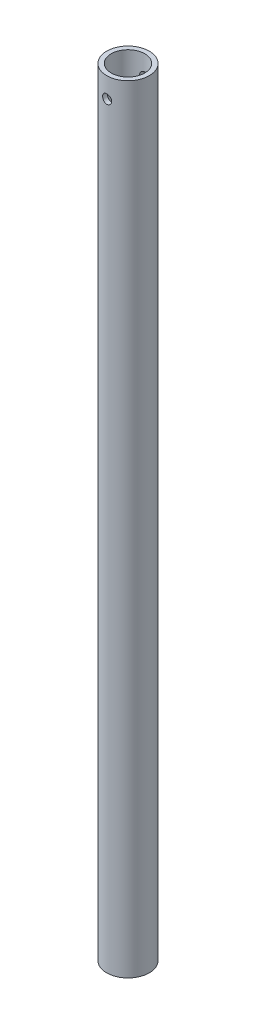
ISO-10303-21;
HEADER;
FILE_DESCRIPTION(('STEP AP214'),'2;1');
FILE_NAME('part.step','',(''),(''),'','','');
FILE_SCHEMA(('AUTOMOTIVE_DESIGN { 1 0 10303 214 1 1 1 1 }'));
ENDSEC;
DATA;
#1=APPLICATION_CONTEXT('core data for automotive mechanical design processes');
#2=APPLICATION_PROTOCOL_DEFINITION('international standard','automotive_design',2000,#1);
#3=PRODUCT_CONTEXT('',#1,'mechanical');
#4=PRODUCT('Part','Part','',(#3));
#5=PRODUCT_RELATED_PRODUCT_CATEGORY('part','',(#4));
#6=PRODUCT_DEFINITION_FORMATION('','',#4);
#7=PRODUCT_DEFINITION_CONTEXT('part definition',#1,'design');
#8=PRODUCT_DEFINITION('design','',#6,#7);
#9=PRODUCT_DEFINITION_SHAPE('','',#8);
#10=(LENGTH_UNIT() NAMED_UNIT(*) SI_UNIT(.MILLI.,.METRE.));
#11=(NAMED_UNIT(*) PLANE_ANGLE_UNIT() SI_UNIT($,.RADIAN.));
#12=(NAMED_UNIT(*) SI_UNIT($,.STERADIAN.) SOLID_ANGLE_UNIT());
#13=UNCERTAINTY_MEASURE_WITH_UNIT(LENGTH_MEASURE(1.E-05),#10,'distance_accuracy_value','');
#14=(GEOMETRIC_REPRESENTATION_CONTEXT(3) GLOBAL_UNCERTAINTY_ASSIGNED_CONTEXT((#13)) GLOBAL_UNIT_ASSIGNED_CONTEXT((#10,
#11,#12)) REPRESENTATION_CONTEXT('',''));
#15=CARTESIAN_POINT('',(0.,0.,0.));
#16=DIRECTION('',(0.,0.,1.));
#17=DIRECTION('',(1.,0.,0.));
#18=AXIS2_PLACEMENT_3D('',#15,#16,#17);
#19=CARTESIAN_POINT('',(0.,0.,0.));
#20=DIRECTION('',(0.,1.,0.));
#21=DIRECTION('',(0.,0.,1.));
#22=AXIS2_PLACEMENT_3D('',#19,#20,#21);
#23=PLANE('',#22);
#24=CARTESIAN_POINT('',(0.,0.,0.));
#25=DIRECTION('',(0.,1.,0.));
#26=DIRECTION('',(0.,0.,1.));
#27=AXIS2_PLACEMENT_3D('',#24,#25,#26);
#28=CIRCLE('',#27,13.1445);
#29=CARTESIAN_POINT('',(0.,0.,13.1445));
#30=VERTEX_POINT('',#29);
#31=EDGE_CURVE('E86',#30,#30,#28,.T.);
#32=ORIENTED_EDGE('',*,*,#31,.T.);
#33=EDGE_LOOP('',(#32));
#34=FACE_BOUND('',#33,.T.);
#35=CARTESIAN_POINT('',(0.,0.,0.));
#36=DIRECTION('',(0.,1.,0.));
#37=DIRECTION('',(0.,0.,1.));
#38=AXIS2_PLACEMENT_3D('',#35,#36,#37);
#39=CIRCLE('',#38,16.7005);
#40=CARTESIAN_POINT('',(0.,0.,16.7005));
#41=VERTEX_POINT('',#40);
#42=EDGE_CURVE('E55',#41,#41,#39,.T.);
#43=ORIENTED_EDGE('',*,*,#42,.F.);
#44=EDGE_LOOP('',(#43));
#45=FACE_BOUND('',#44,.T.);
#46=ADVANCED_FACE('F36',(#34,#45),#23,.F.);
#47=CARTESIAN_POINT('',(0.,609.6,0.));
#48=DIRECTION('',(0.,1.,0.));
#49=DIRECTION('',(0.,0.,1.));
#50=AXIS2_PLACEMENT_3D('',#47,#48,#49);
#51=PLANE('',#50);
#52=CARTESIAN_POINT('',(0.,609.6,0.));
#53=DIRECTION('',(0.,1.,0.));
#54=DIRECTION('',(0.,0.,1.));
#55=AXIS2_PLACEMENT_3D('',#52,#53,#54);
#56=CIRCLE('',#55,13.1445);
#57=CARTESIAN_POINT('',(0.,609.6,13.1445));
#58=VERTEX_POINT('',#57);
#59=EDGE_CURVE('E87',#58,#58,#56,.T.);
#60=ORIENTED_EDGE('',*,*,#59,.F.);
#61=EDGE_LOOP('',(#60));
#62=FACE_BOUND('',#61,.T.);
#63=CARTESIAN_POINT('',(0.,609.6,0.));
#64=DIRECTION('',(0.,1.,0.));
#65=DIRECTION('',(0.,0.,1.));
#66=AXIS2_PLACEMENT_3D('',#63,#64,#65);
#67=CIRCLE('',#66,16.7005);
#68=CARTESIAN_POINT('',(0.,609.6,16.7005));
#69=VERTEX_POINT('',#68);
#70=EDGE_CURVE('E51',#69,#69,#67,.T.);
#71=ORIENTED_EDGE('',*,*,#70,.T.);
#72=EDGE_LOOP('',(#71));
#73=FACE_BOUND('',#72,.T.);
#74=ADVANCED_FACE('F96',(#62,#73),#51,.T.);
#75=CARTESIAN_POINT('',(0.,0.,0.));
#76=DIRECTION('',(0.,1.,0.));
#77=DIRECTION('',(0.,0.,1.));
#78=AXIS2_PLACEMENT_3D('',#75,#76,#77);
#79=CYLINDRICAL_SURFACE('',#78,16.7005);
#80=CARTESIAN_POINT('',(0.,590.15376,16.7005));
#81=CARTESIAN_POINT('',(0.198180128467397,590.153766916919,16.7004963337488));
#82=CARTESIAN_POINT('',(0.39644485112555,590.170312231521,16.6969364344142));
#83=CARTESIAN_POINT('',(0.787350043252914,590.235991986569,16.6830790056128));
#84=CARTESIAN_POINT('',(0.979986263864115,590.285150414705,16.6727765168931));
#85=CARTESIAN_POINT('',(1.35392789600151,590.41445216763,16.6465819057805));
#86=CARTESIAN_POINT('',(1.53524466181015,590.494563844422,16.6306954941354));
#87=CARTESIAN_POINT('',(1.88185554342918,590.683399266575,16.5950509562576));
#88=CARTESIAN_POINT('',(2.04715021727184,590.792122014952,16.5752929649404));
#89=CARTESIAN_POINT('',(2.35957433760585,591.036863258493,16.533732772831));
#90=CARTESIAN_POINT('',(2.506422105691,591.173237216087,16.5119061563597));
#91=CARTESIAN_POINT('',(2.77534243826499,591.468646328024,16.4688422330848));
#92=CARTESIAN_POINT('',(2.89741287037584,591.627683430791,16.4476049771382));
#93=CARTESIAN_POINT('',(3.11454439668957,591.965971846837,16.4078842607787));
#94=CARTESIAN_POINT('',(3.20930782685882,592.145418222158,16.3894321223851));
#95=CARTESIAN_POINT('',(3.36722665713713,592.518147724438,16.3577203528158));
#96=CARTESIAN_POINT('',(3.43038565777865,592.711429272356,16.344460130189));
#97=CARTESIAN_POINT('',(3.52237626915555,593.103293597183,16.3248818041431));
#98=CARTESIAN_POINT('',(3.55170540502194,593.301754451834,16.3184631931365));
#99=CARTESIAN_POINT('',(3.57675029818604,593.700875634117,16.3129928008047));
#100=CARTESIAN_POINT('',(3.57246999855778,593.901535700977,16.3139401553009));
#101=CARTESIAN_POINT('',(3.53081840543797,594.2956765251,16.3230035707971));
#102=CARTESIAN_POINT('',(3.49402300808806,594.489221443267,16.3309948658002));
#103=CARTESIAN_POINT('',(3.38929719409495,594.867326102776,16.3530487038793));
#104=CARTESIAN_POINT('',(3.32136510009737,595.051885359462,16.3671115740326));
#105=CARTESIAN_POINT('',(3.15575979431064,595.408409635789,16.3998482170195));
#106=CARTESIAN_POINT('',(3.05786331339642,595.580267656282,16.4185563981669));
#107=CARTESIAN_POINT('',(2.83526528773563,595.905330916877,16.4584543585796));
#108=CARTESIAN_POINT('',(2.7105602424186,596.058533716948,16.4796444617611));
#109=CARTESIAN_POINT('',(2.43482710263058,596.345255326748,16.5226554031));
#110=CARTESIAN_POINT('',(2.28330880638853,596.478302568999,16.5444802322143));
#111=CARTESIAN_POINT('',(1.95986606623161,596.717172829153,16.5859026211323));
#112=CARTESIAN_POINT('',(1.78794128373359,596.822995395252,16.60550014397));
#113=CARTESIAN_POINT('',(1.42800424917503,597.004520971383,16.640319071282));
#114=CARTESIAN_POINT('',(1.23996101241435,597.08016431524,16.6555317904193));
#115=CARTESIAN_POINT('',(0.853435955602256,597.198650346792,16.6798021685141));
#116=CARTESIAN_POINT('',(0.65495558908012,597.241497588984,16.6888606821055));
#117=CARTESIAN_POINT('',(0.257237341000125,597.292494173422,16.6996810595956));
#118=CARTESIAN_POINT('',(0.0580856758665553,597.301287993776,16.7015784339077));
#119=CARTESIAN_POINT('',(-0.338841041559328,597.285671931545,16.6982415869446));
#120=CARTESIAN_POINT('',(-0.536616182056808,597.261264196515,16.6930078269279));
#121=CARTESIAN_POINT('',(-0.923055503089254,597.180472584674,16.6760821070637));
#122=CARTESIAN_POINT('',(-1.11179317921705,597.12442476495,16.6644580535049));
#123=CARTESIAN_POINT('',(-1.47718935720897,596.982315426609,16.6360520092218));
#124=CARTESIAN_POINT('',(-1.65384686043098,596.896251430197,16.6192695926952));
#125=CARTESIAN_POINT('',(-1.99274729308006,596.695196191905,16.582073127143));
#126=CARTESIAN_POINT('',(-2.15475886597971,596.579823807051,16.5616123561023));
#127=CARTESIAN_POINT('',(-2.45735342289598,596.323930935095,16.519427852075));
#128=CARTESIAN_POINT('',(-2.59793375129851,596.183407336107,16.4977039630315));
#129=CARTESIAN_POINT('',(-2.85620706916956,595.878249667119,16.4549765882197));
#130=CARTESIAN_POINT('',(-2.97345477690698,595.713235526423,16.4339924530576));
#131=CARTESIAN_POINT('',(-3.17857365224335,595.365478675312,16.3955574560704));
#132=CARTESIAN_POINT('',(-3.26644607009319,595.182736719843,16.3781064438835));
#133=CARTESIAN_POINT('',(-3.40974035959568,594.805679451086,16.3488753221426));
#134=CARTESIAN_POINT('',(-3.46534145186944,594.611434789018,16.3370639587312));
#135=CARTESIAN_POINT('',(-3.54304526295326,594.216076085678,16.3203902691574));
#136=CARTESIAN_POINT('',(-3.56515306772184,594.014963092106,16.3155268879497));
#137=CARTESIAN_POINT('',(-3.57503377692477,593.61606092668,16.3133641927147));
#138=CARTESIAN_POINT('',(-3.56351201079232,593.41828973885,16.3159094897465));
#139=CARTESIAN_POINT('',(-3.50803204004136,593.027576162751,16.3279270777278));
#140=CARTESIAN_POINT('',(-3.46407418324189,592.834633722725,16.3373992943985));
#141=CARTESIAN_POINT('',(-3.34530372068774,592.459584875812,16.3621293538191));
#142=CARTESIAN_POINT('',(-3.27058943160135,592.277446037371,16.3773687486721));
#143=CARTESIAN_POINT('',(-3.09251308657374,591.928182390882,16.4119241284166));
#144=CARTESIAN_POINT('',(-2.98914819936011,591.761059068841,16.4312405161545));
#145=CARTESIAN_POINT('',(-2.75434664612804,591.443083912176,16.4722406318213));
#146=CARTESIAN_POINT('',(-2.6224054816834,591.292609516566,16.4939629360763));
#147=CARTESIAN_POINT('',(-2.33522440786867,591.015705309254,16.5370634914949));
#148=CARTESIAN_POINT('',(-2.17997913159185,590.889281051512,16.5584416621459));
#149=CARTESIAN_POINT('',(-1.8483006757458,590.662584629503,16.5987561419888));
#150=CARTESIAN_POINT('',(-1.67163071978423,590.562652676979,16.6176592413828));
#151=CARTESIAN_POINT('',(-1.30363871792517,590.394059063511,16.6505624274905));
#152=CARTESIAN_POINT('',(-1.11232937398777,590.325370645372,16.6645667072064));
#153=CARTESIAN_POINT('',(-0.767301801157866,590.233743342312,16.6835354670588));
#154=CARTESIAN_POINT('',(-0.615477781700589,590.203805789594,16.6898583548463));
#155=CARTESIAN_POINT('',(-0.309119591274204,590.163811825327,16.6983419665027));
#156=CARTESIAN_POINT('',(-0.1545855308649,590.153754604627,16.700502859769));
#157=CARTESIAN_POINT('',(0.,590.15376,16.7005));
#158=B_SPLINE_CURVE_WITH_KNOTS('',3,(#80,#81,#82,#83,#84,#85,#86,#87,#88,#89,#90,#91,#92,#93,
#94,#95,#96,#97,#98,#99,#100,#101,#102,#103,#104,#105,#106,#107,#108,#109,#110,#111,#112,#113,
#114,#115,#116,#117,#118,#119,#120,#121,#122,#123,#124,#125,#126,#127,#128,#129,#130,#131,#132,
#133,#134,#135,#136,#137,#138,#139,#140,#141,#142,#143,#144,#145,#146,#147,#148,#149,#150,#151,
#152,#153,#154,#155,#156,#157),.UNSPECIFIED.,.T.,.F.,(4,2,2,2,2,2,2,2,2,2,2,2,2,2,2,2,2,2,2,2,2,
2,2,2,2,2,2,2,2,2,2,2,2,2,2,2,2,2,4),(0.,0.593974629123738,1.18838662522063,1.7821924691207,
2.37597762396337,2.977944459589,3.57996307951795,4.18831526537019,4.79659812895343,
5.39581628516933,5.99496414189277,6.58370815049623,7.17248387885598,7.76575810309693,
8.35910984215814,8.96470890985258,9.57031802701425,10.1771186067958,10.7838349030117,
11.3790110060325,11.9741486135033,12.5630809374933,13.1520618885512,13.7491338953982,
14.3462798273166,14.9539123201624,15.5615189480783,16.1657180887493,16.7698254725308,
17.361354257063,17.9528766985994,18.5425227716931,19.1322271348166,19.7333425626662,
20.3345966396108,20.9432341055184,21.5513493438405,22.014683490752,22.4779987790882),.UNSPECIFIED.);
#159=CARTESIAN_POINT('',(0.,590.15376,16.7005));
#160=VERTEX_POINT('',#159);
#161=EDGE_CURVE('E11',#160,#160,#158,.T.);
#162=ORIENTED_EDGE('',*,*,#161,.F.);
#163=EDGE_LOOP('',(#162));
#164=FACE_BOUND('',#163,.T.);
#165=CARTESIAN_POINT('',(0.,597.29624,-16.7005));
#166=CARTESIAN_POINT('',(0.198180128467397,597.29623308308,-16.7004963337488));
#167=CARTESIAN_POINT('',(0.39644485112555,597.279687768478,-16.6969364344142));
#168=CARTESIAN_POINT('',(0.787350043252914,597.21400801343,-16.6830790056128));
#169=CARTESIAN_POINT('',(0.979986263864115,597.164849585295,-16.6727765168931));
#170=CARTESIAN_POINT('',(1.35392789600151,597.03554783237,-16.6465819057805));
#171=CARTESIAN_POINT('',(1.53524466181015,596.955436155577,-16.6306954941354));
#172=CARTESIAN_POINT('',(1.88185554342918,596.766600733424,-16.5950509562576));
#173=CARTESIAN_POINT('',(2.04715021727184,596.657877985048,-16.5752929649404));
#174=CARTESIAN_POINT('',(2.35957433760585,596.413136741506,-16.533732772831));
#175=CARTESIAN_POINT('',(2.506422105691,596.276762783912,-16.5119061563597));
#176=CARTESIAN_POINT('',(2.77534243826499,595.981353671976,-16.4688422330848));
#177=CARTESIAN_POINT('',(2.89741287037584,595.822316569209,-16.4476049771382));
#178=CARTESIAN_POINT('',(3.11454439668957,595.484028153163,-16.4078842607787));
#179=CARTESIAN_POINT('',(3.20930782685882,595.304581777842,-16.3894321223851));
#180=CARTESIAN_POINT('',(3.36722665713713,594.931852275562,-16.3577203528158));
#181=CARTESIAN_POINT('',(3.43038565777865,594.738570727643,-16.344460130189));
#182=CARTESIAN_POINT('',(3.52237626915555,594.346706402817,-16.3248818041431));
#183=CARTESIAN_POINT('',(3.55170540502194,594.148245548166,-16.3184631931365));
#184=CARTESIAN_POINT('',(3.57675029818604,593.749124365883,-16.3129928008047));
#185=CARTESIAN_POINT('',(3.57246999855779,593.548464299023,-16.3139401553009));
#186=CARTESIAN_POINT('',(3.53081840543798,593.154323474899,-16.3230035707971));
#187=CARTESIAN_POINT('',(3.49402300808809,592.960778556733,-16.3309948658002));
#188=CARTESIAN_POINT('',(3.38929719409502,592.582673897224,-16.3530487038793));
#189=CARTESIAN_POINT('',(3.32136510009741,592.398114640538,-16.3671115740326));
#190=CARTESIAN_POINT('',(3.15575979431064,592.041590364211,-16.3998482170195));
#191=CARTESIAN_POINT('',(3.05786331339642,591.869732343717,-16.4185563981669));
#192=CARTESIAN_POINT('',(2.83526528773563,591.544669083122,-16.4584543585796));
#193=CARTESIAN_POINT('',(2.7105602424186,591.391466283051,-16.4796444617611));
#194=CARTESIAN_POINT('',(2.43482710263058,591.104744673252,-16.5226554031));
#195=CARTESIAN_POINT('',(2.28330880638853,590.971697431,-16.5444802322143));
#196=CARTESIAN_POINT('',(1.95986606623161,590.732827170847,-16.5859026211323));
#197=CARTESIAN_POINT('',(1.78794128373359,590.627004604748,-16.60550014397));
#198=CARTESIAN_POINT('',(1.42800424917501,590.445479028617,-16.640319071282));
#199=CARTESIAN_POINT('',(1.23996101241431,590.36983568476,-16.6555317904193));
#200=CARTESIAN_POINT('',(0.853435955602212,590.251349653207,-16.6798021685141));
#201=CARTESIAN_POINT('',(0.654955589080099,590.208502411016,-16.6888606821055));
#202=CARTESIAN_POINT('',(0.257237341000129,590.157505826577,-16.6996810595956));
#203=CARTESIAN_POINT('',(0.0580856758665614,590.148712006224,-16.7015784339077));
#204=CARTESIAN_POINT('',(-0.338841041559322,590.164328068455,-16.6982415869446));
#205=CARTESIAN_POINT('',(-0.536616182056806,590.188735803485,-16.6930078269279));
#206=CARTESIAN_POINT('',(-0.923055503089254,590.269527415326,-16.6760821070637));
#207=CARTESIAN_POINT('',(-1.11179317921705,590.325575235049,-16.6644580535049));
#208=CARTESIAN_POINT('',(-1.47718935720897,590.467684573391,-16.6360520092218));
#209=CARTESIAN_POINT('',(-1.65384686043098,590.553748569802,-16.6192695926952));
#210=CARTESIAN_POINT('',(-1.99274729308006,590.754803808094,-16.582073127143));
#211=CARTESIAN_POINT('',(-2.15475886597971,590.870176192948,-16.5616123561023));
#212=CARTESIAN_POINT('',(-2.45735342289598,591.126069064905,-16.519427852075));
#213=CARTESIAN_POINT('',(-2.59793375129851,591.266592663893,-16.4977039630315));
#214=CARTESIAN_POINT('',(-2.85620706916956,591.57175033288,-16.4549765882197));
#215=CARTESIAN_POINT('',(-2.97345477690698,591.736764473577,-16.4339924530576));
#216=CARTESIAN_POINT('',(-3.17857365224335,592.084521324688,-16.3955574560704));
#217=CARTESIAN_POINT('',(-3.26644607009319,592.267263280157,-16.3781064438835));
#218=CARTESIAN_POINT('',(-3.40974035959568,592.644320548914,-16.3488753221426));
#219=CARTESIAN_POINT('',(-3.46534145186944,592.838565210982,-16.3370639587312));
#220=CARTESIAN_POINT('',(-3.54304526295326,593.233923914322,-16.3203902691574));
#221=CARTESIAN_POINT('',(-3.56515306772184,593.435036907894,-16.3155268879497));
#222=CARTESIAN_POINT('',(-3.57503377692477,593.833939073319,-16.3133641927147));
#223=CARTESIAN_POINT('',(-3.56351201079232,594.03171026115,-16.3159094897465));
#224=CARTESIAN_POINT('',(-3.50803204004136,594.422423837249,-16.3279270777278));
#225=CARTESIAN_POINT('',(-3.46407418324189,594.615366277274,-16.3373992943985));
#226=CARTESIAN_POINT('',(-3.34530372068771,594.990415124188,-16.3621293538191));
#227=CARTESIAN_POINT('',(-3.27058943160127,595.172553962629,-16.3773687486721));
#228=CARTESIAN_POINT('',(-3.09251308657364,595.521817609118,-16.4119241284166));
#229=CARTESIAN_POINT('',(-2.98914819936006,595.688940931159,-16.4312405161545));
#230=CARTESIAN_POINT('',(-2.75434664612805,596.006916087824,-16.4722406318213));
#231=CARTESIAN_POINT('',(-2.6224054816834,596.157390483433,-16.4939629360763));
#232=CARTESIAN_POINT('',(-2.33522440786867,596.434294690746,-16.5370634914949));
#233=CARTESIAN_POINT('',(-2.17997913159185,596.560718948487,-16.5584416621459));
#234=CARTESIAN_POINT('',(-1.8483006757458,596.787415370497,-16.5987561419888));
#235=CARTESIAN_POINT('',(-1.67163071978423,596.887347323021,-16.6176592413828));
#236=CARTESIAN_POINT('',(-1.30363871792517,597.055940936489,-16.6505624274905));
#237=CARTESIAN_POINT('',(-1.11232937398777,597.124629354628,-16.6645667072064));
#238=CARTESIAN_POINT('',(-0.767301801157866,597.216256657688,-16.6835354670588));
#239=CARTESIAN_POINT('',(-0.615477781700589,597.246194210406,-16.6898583548463));
#240=CARTESIAN_POINT('',(-0.309119591274204,597.286188174673,-16.6983419665027));
#241=CARTESIAN_POINT('',(-0.1545855308649,597.296245395373,-16.700502859769));
#242=CARTESIAN_POINT('',(0.,597.29624,-16.7005));
#243=B_SPLINE_CURVE_WITH_KNOTS('',3,(#165,#166,#167,#168,#169,#170,#171,#172,#173,#174,#175,
#176,#177,#178,#179,#180,#181,#182,#183,#184,#185,#186,#187,#188,#189,#190,#191,#192,#193,#194,
#195,#196,#197,#198,#199,#200,#201,#202,#203,#204,#205,#206,#207,#208,#209,#210,#211,#212,#213,
#214,#215,#216,#217,#218,#219,#220,#221,#222,#223,#224,#225,#226,#227,#228,#229,#230,#231,#232,
#233,#234,#235,#236,#237,#238,#239,#240,#241,#242),.UNSPECIFIED.,.T.,.F.,(4,2,2,2,2,2,2,2,2,2,2,
2,2,2,2,2,2,2,2,2,2,2,2,2,2,2,2,2,2,2,2,2,2,2,2,2,2,2,4),(0.,0.593974629123738,1.18838662522063,
1.7821924691207,2.37597762396337,2.977944459589,3.57996307951795,4.18831526537019,
4.79659812895343,5.39581628516933,5.99496414189277,6.58370815049589,7.17248387885598,
7.76575810309693,8.35910984215813,8.96470890985258,9.57031802701425,10.1771186067958,
10.7838349030117,11.3790110060325,11.9741486135033,12.5630809374933,13.1520618885512,
13.7491338953982,14.3462798273166,14.9539123201624,15.5615189480783,16.1657180887493,
16.7698254725308,17.361354257063,17.9528766985994,18.5425227716934,19.1322271348166,
19.7333425626662,20.3345966396108,20.9432341055184,21.5513493438405,22.014683490752,
22.4779987790882),.UNSPECIFIED.);
#244=CARTESIAN_POINT('',(0.,597.29624,-16.7005));
#245=VERTEX_POINT('',#244);
#246=EDGE_CURVE('E47',#245,#245,#243,.T.);
#247=ORIENTED_EDGE('',*,*,#246,.F.);
#248=EDGE_LOOP('',(#247));
#249=FACE_BOUND('',#248,.T.);
#250=ORIENTED_EDGE('',*,*,#70,.F.);
#251=EDGE_LOOP('',(#250));
#252=FACE_BOUND('',#251,.T.);
#253=ORIENTED_EDGE('',*,*,#42,.T.);
#254=EDGE_LOOP('',(#253));
#255=FACE_BOUND('',#254,.T.);
#256=ADVANCED_FACE('F61',(#164,#249,#252,#255),#79,.T.);
#257=CARTESIAN_POINT('',(0.,0.,0.));
#258=DIRECTION('',(0.,1.,0.));
#259=DIRECTION('',(0.,0.,1.));
#260=AXIS2_PLACEMENT_3D('',#257,#258,#259);
#261=CYLINDRICAL_SURFACE('',#260,13.1445);
#262=CARTESIAN_POINT('',(0.,590.15376,13.1445));
#263=CARTESIAN_POINT('',(0.196734814294615,590.153764378364,13.1444971760718));
#264=CARTESIAN_POINT('',(0.393516001561489,590.170071213926,13.1400398888218));
#265=CARTESIAN_POINT('',(0.78140069505591,590.234746649612,13.1226921056815));
#266=CARTESIAN_POINT('',(0.972501578845284,590.28312982546,13.109797775972));
#267=CARTESIAN_POINT('',(1.34337133102817,590.410262055463,13.0769976305413));
#268=CARTESIAN_POINT('',(1.52315475811126,590.488971129889,13.0571010491192));
#269=CARTESIAN_POINT('',(1.86696995059322,590.674370376731,13.0123940642889));
#270=CARTESIAN_POINT('',(2.03100050744225,590.781062693664,12.9875832843131));
#271=CARTESIAN_POINT('',(2.34258889548332,591.022101565236,12.9350564225104));
#272=CARTESIAN_POINT('',(2.48971499848659,591.156995073441,12.9072892095964));
#273=CARTESIAN_POINT('',(2.75955970986045,591.449438514433,12.8523038782919));
#274=CARTESIAN_POINT('',(2.8822750478221,591.606991478134,12.825085833914));
#275=CARTESIAN_POINT('',(3.10194349061531,591.9437571414,12.7737550574884));
#276=CARTESIAN_POINT('',(3.19839560101738,592.123307350828,12.7497067033389));
#277=CARTESIAN_POINT('',(3.35957111332819,592.496835208983,12.7081917492458));
#278=CARTESIAN_POINT('',(3.42430061388786,592.690810076313,12.690723884357));
#279=CARTESIAN_POINT('',(3.51868580557237,593.082889538336,12.6648763017439));
#280=CARTESIAN_POINT('',(3.54912621235336,593.280791518654,12.6562936327321));
#281=CARTESIAN_POINT('',(3.57651621518975,593.6790650825,12.6485822015427));
#282=CARTESIAN_POINT('',(3.57347232770244,593.879436177925,12.6494515998757));
#283=CARTESIAN_POINT('',(3.53460216942576,594.270799554918,12.6603646788483));
#284=CARTESIAN_POINT('',(3.49973009718289,594.46189524522,12.6701413083803));
#285=CARTESIAN_POINT('',(3.39972365258786,594.835415910685,12.6973390361955));
#286=CARTESIAN_POINT('',(3.33458677974115,595.017840168035,12.7147607661145));
#287=CARTESIAN_POINT('',(3.17513315267934,595.371304632213,12.7555173528351));
#288=CARTESIAN_POINT('',(3.08048552975019,595.542187589351,12.7789186859865));
#289=CARTESIAN_POINT('',(2.86492777444314,595.865978804228,12.8289625547442));
#290=CARTESIAN_POINT('',(2.74401229573363,596.018883393026,12.8556057496846));
#291=CARTESIAN_POINT('',(2.47449233792716,596.307823773253,12.9102388632684));
#292=CARTESIAN_POINT('',(2.32508786696849,596.443111584833,12.9382438103255));
#293=CARTESIAN_POINT('',(2.00536825434316,596.686868197862,12.9916360733779));
#294=CARTESIAN_POINT('',(1.83505222578218,596.795335861236,13.0170232782664));
#295=CARTESIAN_POINT('',(1.47715710542602,596.982719974395,13.062485740196));
#296=CARTESIAN_POINT('',(1.28950144001944,597.061496698781,13.082535753751));
#297=CARTESIAN_POINT('',(0.90293991327048,597.186166243206,13.1148824767922));
#298=CARTESIAN_POINT('',(0.704036618047962,597.232066531528,13.1271809470595));
#299=CARTESIAN_POINT('',(0.307005770423006,597.288495717986,13.1423708245684));
#300=CARTESIAN_POINT('',(0.109032804050557,597.300041065656,13.1455324762205));
#301=CARTESIAN_POINT('',(-0.28602216467824,597.29024571559,13.142871731123));
#302=CARTESIAN_POINT('',(-0.483104260612896,597.268908556362,13.1370503010485));
#303=CARTESIAN_POINT('',(-0.867125214790368,597.194786113737,13.1172524341221));
#304=CARTESIAN_POINT('',(-1.05418259206123,597.142571656327,13.1034241144087));
#305=CARTESIAN_POINT('',(-1.41686192640417,597.008843085413,13.0691848499248));
#306=CARTESIAN_POINT('',(-1.59248261834892,596.927325736901,13.0487731783849));
#307=CARTESIAN_POINT('',(-1.93122301109764,596.735446138518,13.0030028146807));
#308=CARTESIAN_POINT('',(-2.09401973917127,596.624536059711,12.9775527757279));
#309=CARTESIAN_POINT('',(-2.39904652627533,596.377704577267,12.9246455200942));
#310=CARTESIAN_POINT('',(-2.54127235239184,596.241778038985,12.8971878920528));
#311=CARTESIAN_POINT('',(-2.80543193446934,595.944022463773,12.8423593352832));
#312=CARTESIAN_POINT('',(-2.92664744105825,595.781550178195,12.8150146133221));
#313=CARTESIAN_POINT('',(-3.14011415223446,595.437988828262,12.764389695297));
#314=CARTESIAN_POINT('',(-3.23236652505416,595.256900515177,12.7411093353133));
#315=CARTESIAN_POINT('',(-3.38459637053665,594.88211865391,12.7015187280531));
#316=CARTESIAN_POINT('',(-3.44475766310845,594.688504180139,12.6851688954922));
#317=CARTESIAN_POINT('',(-3.53151200920316,594.293384204233,12.6612940222037));
#318=CARTESIAN_POINT('',(-3.55811404205927,594.091880827789,12.6537666209275));
#319=CARTESIAN_POINT('',(-3.57646398791924,593.694071152092,12.6485913361503));
#320=CARTESIAN_POINT('',(-3.56936849944809,593.497821685787,12.6506155957682));
#321=CARTESIAN_POINT('',(-3.52321893875573,593.109430438564,12.6635449558301));
#322=CARTESIAN_POINT('',(-3.48416574913394,592.917288544355,12.6744498110121));
#323=CARTESIAN_POINT('',(-3.37589153725019,592.544084545661,12.7037127676964));
#324=CARTESIAN_POINT('',(-3.30692439104642,592.362943512752,12.7220080596442));
#325=CARTESIAN_POINT('',(-3.14097669509761,592.014664562613,12.7639899119015));
#326=CARTESIAN_POINT('',(-3.04399160019914,591.847528923058,12.7876773468078));
#327=CARTESIAN_POINT('',(-2.82129307562297,591.526506098928,12.8386756166972));
#328=CARTESIAN_POINT('',(-2.69479461045327,591.373177485765,12.8660748386042));
#329=CARTESIAN_POINT('',(-2.41814160852195,591.089548331336,12.9209258439768));
#330=CARTESIAN_POINT('',(-2.26798127911552,590.959253445557,12.9483776386828));
#331=CARTESIAN_POINT('',(-1.94419792421026,590.722507090148,13.0009784037949));
#332=CARTESIAN_POINT('',(-1.77012364619755,590.616656922584,13.0260617985361));
#333=CARTESIAN_POINT('',(-1.40597356725947,590.435888341459,13.0703733534209));
#334=CARTESIAN_POINT('',(-1.21590773544791,590.360950826499,13.0896051274362));
#335=CARTESIAN_POINT('',(-0.855560772325295,590.253478556845,13.1176732796793));
#336=CARTESIAN_POINT('',(-0.686776937718823,590.216172927574,13.127658628125));
#337=CARTESIAN_POINT('',(-0.34534036774025,590.166313052653,13.1410728766577));
#338=CARTESIAN_POINT('',(-0.172688048625005,590.153756156801,13.1445024787613));
#339=CARTESIAN_POINT('',(0.,590.15376,13.1445));
#340=B_SPLINE_CURVE_WITH_KNOTS('',3,(#262,#263,#264,#265,#266,#267,#268,#269,#270,#271,#272,
#273,#274,#275,#276,#277,#278,#279,#280,#281,#282,#283,#284,#285,#286,#287,#288,#289,#290,#291,
#292,#293,#294,#295,#296,#297,#298,#299,#300,#301,#302,#303,#304,#305,#306,#307,#308,#309,#310,
#311,#312,#313,#314,#315,#316,#317,#318,#319,#320,#321,#322,#323,#324,#325,#326,#327,#328,#329,
#330,#331,#332,#333,#334,#335,#336,#337,#338,#339),.UNSPECIFIED.,.T.,.F.,(4,2,2,2,2,2,2,2,2,2,2,
2,2,2,2,2,2,2,2,2,2,2,2,2,2,2,2,2,2,2,2,2,2,2,2,2,2,2,4),(0.,0.589571005769807,1.17941010071858,
1.76847423558072,2.35758352701369,2.95940225322194,3.56130155329697,4.1739854534758,
4.78655151932546,5.38479440061382,5.98292085850762,6.56368441760561,7.14449596824427,
7.73206901069686,8.31976175490152,8.92738608914993,9.5350362026759,10.1455112313923,
10.755847539255,11.3479370309964,11.9399628120508,12.5213717046057,13.102844803804,
13.6960278079939,14.2893326994611,14.9000544160147,15.5107514958495,16.1179118389065,
16.724909691724,17.3112271760549,17.8975284681695,18.478948378811,19.0604626621027,
19.6596887061883,20.2590616749511,20.8718975995607,21.484354274241,22.0019178335628,
22.5194259669215),.UNSPECIFIED.);
#341=CARTESIAN_POINT('',(0.,590.15376,13.1445));
#342=VERTEX_POINT('',#341);
#343=EDGE_CURVE('E80',#342,#342,#340,.T.);
#344=ORIENTED_EDGE('',*,*,#343,.T.);
#345=EDGE_LOOP('',(#344));
#346=FACE_BOUND('',#345,.T.);
#347=CARTESIAN_POINT('',(3.57123999999999,593.725,-12.6500642335286));
#348=CARTESIAN_POINT('',(3.57123554935219,593.528416358488,-12.6500674973936));
#349=CARTESIAN_POINT('',(3.55495289596663,593.331786210478,-12.6546967420866));
#350=CARTESIAN_POINT('',(3.49038220425838,592.944214680323,-12.6726555532177));
#351=CARTESIAN_POINT('',(3.44207890138384,592.75327605677,-12.685989269115));
#352=CARTESIAN_POINT('',(3.31518003562076,592.382750676962,-12.7197378955362));
#353=CARTESIAN_POINT('',(3.23662816967044,592.203147978496,-12.7401425871242));
#354=CARTESIAN_POINT('',(3.05159993273667,591.859639615196,-12.7857209307242));
#355=CARTESIAN_POINT('',(2.94512109184095,591.695735340512,-12.8108950044942));
#356=CARTESIAN_POINT('',(2.70430500280925,591.384021408672,-12.8639080554163));
#357=CARTESIAN_POINT('',(2.56937270051415,591.23667964235,-12.8917957025217));
#358=CARTESIAN_POINT('',(2.27675904351758,590.96641387182,-12.9466742234978));
#359=CARTESIAN_POINT('',(2.11907525720518,590.843492480931,-12.9736650011338));
#360=CARTESIAN_POINT('',(1.7821781851315,590.62359411841,-13.0242531648666));
#361=CARTESIAN_POINT('',(1.60264970147265,590.527084019782,-13.0477864510996));
#362=CARTESIAN_POINT('',(1.22916800498836,590.365795496759,-13.088248625138));
#363=CARTESIAN_POINT('',(1.03521732756619,590.301011510072,-13.1051786705319));
#364=CARTESIAN_POINT('',(0.64328232829537,590.206533382937,-13.1301826323045));
#365=CARTESIAN_POINT('',(0.445502990019399,590.176042922495,-13.138457200939));
#366=CARTESIAN_POINT('',(0.0474747951687445,590.148510182131,-13.1459201725723));
#367=CARTESIAN_POINT('',(-0.152773626944238,590.151462099251,-13.1451101519387));
#368=CARTESIAN_POINT('',(-0.5445067058346,590.190173309476,-13.1346414884009));
#369=CARTESIAN_POINT('',(-0.736083564599259,590.225071976656,-13.1252149781989));
#370=CARTESIAN_POINT('',(-1.11055212802383,590.325293455477,-13.098847590854));
#371=CARTESIAN_POINT('',(-1.29344332753023,590.39061803429,-13.0819062772451));
#372=CARTESIAN_POINT('',(-1.64752408821363,590.55048534327,-13.0420718955079));
#373=CARTESIAN_POINT('',(-1.81857520056092,590.645319418061,-13.0191198587673));
#374=CARTESIAN_POINT('',(-2.14262658062465,590.861289209519,-12.9697316254832));
#375=CARTESIAN_POINT('',(-2.29562320527668,590.982430220484,-12.9432947280292));
#376=CARTESIAN_POINT('',(-2.58436010547215,591.252129113019,-12.8888036566397));
#377=CARTESIAN_POINT('',(-2.71939597236239,591.401437035092,-12.8607247896261));
#378=CARTESIAN_POINT('',(-2.96268783111135,591.720867943205,-12.8068704359416));
#379=CARTESIAN_POINT('',(-3.07094205916329,591.890992299088,-12.7810951010501));
#380=CARTESIAN_POINT('',(-3.25816145646974,592.248800632232,-12.7346641600397));
#381=CARTESIAN_POINT('',(-3.33692823550873,592.436593275244,-12.7140435321151));
#382=CARTESIAN_POINT('',(-3.46153783954766,592.823457047487,-12.6806878112466));
#383=CARTESIAN_POINT('',(-3.50738918819097,593.022525242432,-12.6679506769438));
#384=CARTESIAN_POINT('',(-3.56363752310063,593.419684472913,-12.6522409234042));
#385=CARTESIAN_POINT('',(-3.57508817534394,593.617614968085,-12.6489782177927));
#386=CARTESIAN_POINT('',(-3.5651188328946,594.012563920329,-12.6517918273884));
#387=CARTESIAN_POINT('',(-3.54370248845347,594.209582476244,-12.6578671055071));
#388=CARTESIAN_POINT('',(-3.46953744453267,594.593008120043,-12.6783912746675));
#389=CARTESIAN_POINT('',(-3.4174285033955,594.779549011449,-12.6926690467682));
#390=CARTESIAN_POINT('',(-3.28407996687795,595.141241302753,-12.727820823844));
#391=CARTESIAN_POINT('',(-3.20283646144874,595.316391170171,-12.7486957141508));
#392=CARTESIAN_POINT('',(-3.01140637825196,595.654720250251,-12.7952802914005));
#393=CARTESIAN_POINT('',(-2.90060457377367,595.817537410647,-12.8210889843697));
#394=CARTESIAN_POINT('',(-2.653961068663,596.12265424225,-12.8744032568262));
#395=CARTESIAN_POINT('',(-2.51811447538421,596.264949894763,-12.9019091671751));
#396=CARTESIAN_POINT('',(-2.2203522239269,596.529391800837,-12.9565221824062));
#397=CARTESIAN_POINT('',(-2.05777423694694,596.650801466638,-12.9835922789003));
#398=CARTESIAN_POINT('',(-1.71393679049281,596.864610017915,-13.0334351634827));
#399=CARTESIAN_POINT('',(-1.53267832596573,596.957010447402,-13.0562081802565));
#400=CARTESIAN_POINT('',(-1.15790060845889,597.109318453211,-13.0947441664559));
#401=CARTESIAN_POINT('',(-0.964486257563593,597.169470224132,-13.1105596511612));
#402=CARTESIAN_POINT('',(-0.569798840390788,597.256272732606,-13.1336299965622));
#403=CARTESIAN_POINT('',(-0.36852759816859,597.282931198828,-13.1408868321654));
#404=CARTESIAN_POINT('',(0.029290099360577,597.301490936027,-13.1459250494898));
#405=CARTESIAN_POINT('',(0.225783210109762,597.294470770219,-13.1440004783609));
#406=CARTESIAN_POINT('',(0.61468240722859,597.248387475701,-13.1315611435563));
#407=CARTESIAN_POINT('',(0.807088657265576,597.209325632663,-13.1210467245479));
#408=CARTESIAN_POINT('',(1.18100280512577,597.100886812443,-13.0926713393227));
#409=CARTESIAN_POINT('',(1.36258074057843,597.031736022344,-13.0748652443732));
#410=CARTESIAN_POINT('',(1.71166008784081,596.865283745225,-13.0337648297377));
#411=CARTESIAN_POINT('',(1.87915946424631,596.76797819674,-13.0104697183238));
#412=CARTESIAN_POINT('',(2.20031827580747,596.544863265669,-12.960079048685));
#413=CARTESIAN_POINT('',(2.3534709684445,596.418344144653,-12.9328966527437));
#414=CARTESIAN_POINT('',(2.63673608218994,596.141729646182,-12.8781349929709));
#415=CARTESIAN_POINT('',(2.76684235287572,595.99162799534,-12.8505556253159));
#416=CARTESIAN_POINT('',(3.00330007017803,595.667944153682,-12.7973875026566));
#417=CARTESIAN_POINT('',(3.10903422107503,595.493900140109,-12.7718593523776));
#418=CARTESIAN_POINT('',(3.28959344376972,595.129833405127,-12.7265540282442));
#419=CARTESIAN_POINT('',(3.36443799752681,594.939820846333,-12.7067732318915));
#420=CARTESIAN_POINT('',(3.47172465047915,594.579695140749,-12.6778381508413));
#421=CARTESIAN_POINT('',(3.50895322861753,594.411087638765,-12.6675091265274));
#422=CARTESIAN_POINT('',(3.55871132107383,594.069998373812,-12.6536211565262));
#423=CARTESIAN_POINT('',(3.5712439057819,593.897517095157,-12.6500613692389));
#424=CARTESIAN_POINT('',(3.57123999999999,593.725,-12.6500642335286));
#425=B_SPLINE_CURVE_WITH_KNOTS('',3,(#347,#348,#349,#350,#351,#352,#353,#354,#355,#356,#357,
#358,#359,#360,#361,#362,#363,#364,#365,#366,#367,#368,#369,#370,#371,#372,#373,#374,#375,#376,
#377,#378,#379,#380,#381,#382,#383,#384,#385,#386,#387,#388,#389,#390,#391,#392,#393,#394,#395,
#396,#397,#398,#399,#400,#401,#402,#403,#404,#405,#406,#407,#408,#409,#410,#411,#412,#413,#414,
#415,#416,#417,#418,#419,#420,#421,#422,#423,#424),.UNSPECIFIED.,.T.,.F.,(4,2,2,2,2,2,2,2,2,2,2,
2,2,2,2,2,2,2,2,2,2,2,2,2,2,2,2,2,2,2,2,2,2,2,2,2,2,2,4),(0.,0.589116276580594,1.17851359271103,
1.76706264305046,2.35566376329737,2.95807601094113,3.56055269037045,4.17307708878991,
4.78549405962263,5.38337610624441,5.98115440933694,6.56328821555388,7.14545583701725,
7.73356398684924,8.32179060393215,8.9287433220016,9.53573600261807,10.1467420840936,
10.7575898848361,11.3495268035929,11.9413979858207,12.5213481871038,13.1013762506385,
13.6945728560105,14.2878854688517,14.8990809516792,15.5102438982291,16.1167111566413,
16.723038445395,17.3100800788097,17.8970981583542,18.4797776993988,19.0625413368116,
19.661317642701,20.2602535046858,20.8730073429488,21.4853741267762,22.0024327490479,
22.5194270826771),.UNSPECIFIED.);
#426=CARTESIAN_POINT('',(3.57123999999999,593.725,-12.6500642335286));
#427=VERTEX_POINT('',#426);
#428=EDGE_CURVE('E75',#427,#427,#425,.T.);
#429=ORIENTED_EDGE('',*,*,#428,.T.);
#430=EDGE_LOOP('',(#429));
#431=FACE_BOUND('',#430,.T.);
#432=ORIENTED_EDGE('',*,*,#59,.T.);
#433=EDGE_LOOP('',(#432));
#434=FACE_BOUND('',#433,.T.);
#435=ORIENTED_EDGE('',*,*,#31,.F.);
#436=EDGE_LOOP('',(#435));
#437=FACE_BOUND('',#436,.T.);
#438=ADVANCED_FACE('F68',(#346,#431,#434,#437),#261,.F.);
#439=CARTESIAN_POINT('',(0.,593.725,16.7005));
#440=DIRECTION('',(0.,0.,1.));
#441=DIRECTION('',(1.,0.,0.));
#442=AXIS2_PLACEMENT_3D('',#439,#440,#441);
#443=CYLINDRICAL_SURFACE('',#442,3.57123999999999);
#444=ORIENTED_EDGE('',*,*,#246,.T.);
#445=EDGE_LOOP('',(#444));
#446=FACE_BOUND('',#445,.T.);
#447=ORIENTED_EDGE('',*,*,#428,.F.);
#448=EDGE_LOOP('',(#447));
#449=FACE_BOUND('',#448,.T.);
#450=ADVANCED_FACE('F67',(#446,#449),#443,.F.);
#451=ORIENTED_EDGE('',*,*,#161,.T.);
#452=EDGE_LOOP('',(#451));
#453=FACE_BOUND('',#452,.T.);
#454=ORIENTED_EDGE('',*,*,#343,.F.);
#455=EDGE_LOOP('',(#454));
#456=FACE_BOUND('',#455,.T.);
#457=ADVANCED_FACE('F64',(#453,#456),#443,.F.);
#458=CLOSED_SHELL('',(#46,#74,#256,#438,#450,#457));
#459=MANIFOLD_SOLID_BREP('B2',#458);
#460=ADVANCED_BREP_SHAPE_REPRESENTATION('',(#18,#459),#14);
#461=SHAPE_DEFINITION_REPRESENTATION(#9,#460);
ENDSEC;
END-ISO-10303-21;
